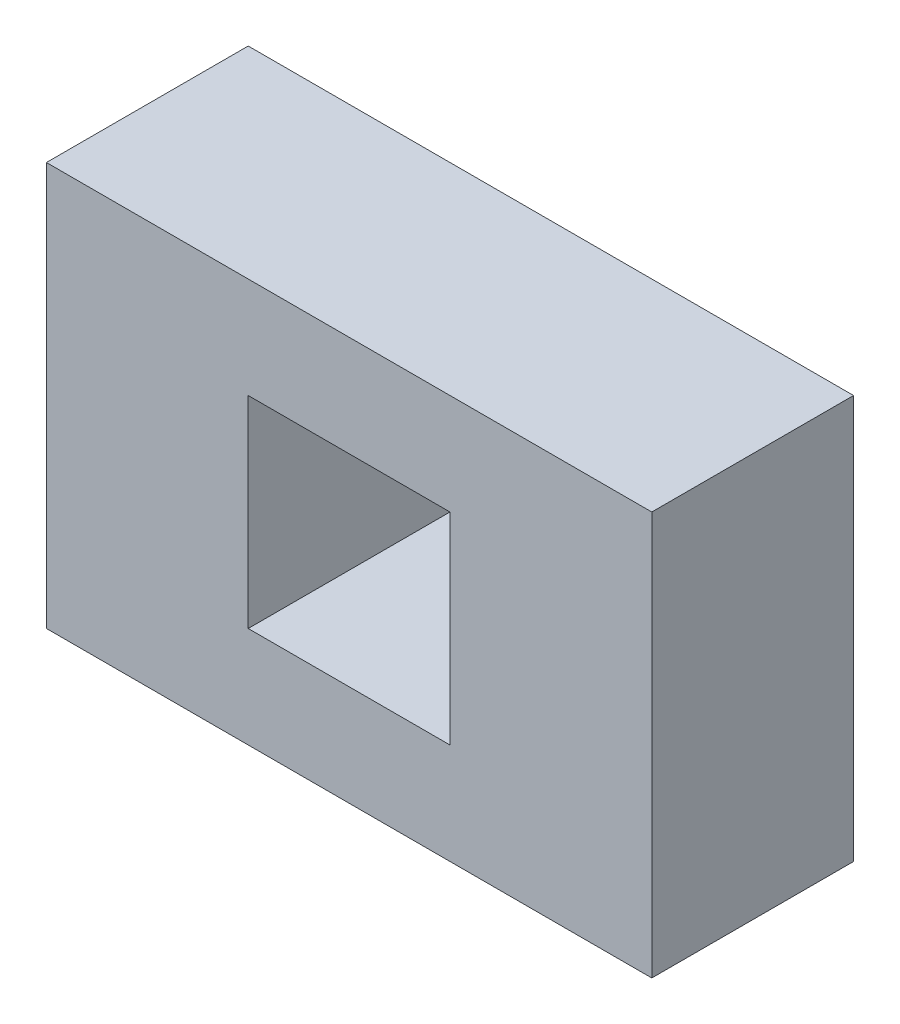
ISO-10303-21;
HEADER;
FILE_DESCRIPTION(('STEP AP214'),'2;1');
FILE_NAME('part.step','',(''),(''),'','','');
FILE_SCHEMA(('AUTOMOTIVE_DESIGN { 1 0 10303 214 1 1 1 1 }'));
ENDSEC;
DATA;
#1=APPLICATION_CONTEXT('core data for automotive mechanical design processes');
#2=APPLICATION_PROTOCOL_DEFINITION('international standard','automotive_design',2000,#1);
#3=PRODUCT_CONTEXT('',#1,'mechanical');
#4=PRODUCT('Part','Part','',(#3));
#5=PRODUCT_RELATED_PRODUCT_CATEGORY('part','',(#4));
#6=PRODUCT_DEFINITION_FORMATION('','',#4);
#7=PRODUCT_DEFINITION_CONTEXT('part definition',#1,'design');
#8=PRODUCT_DEFINITION('design','',#6,#7);
#9=PRODUCT_DEFINITION_SHAPE('','',#8);
#10=(LENGTH_UNIT() NAMED_UNIT(*) SI_UNIT(.MILLI.,.METRE.));
#11=(NAMED_UNIT(*) PLANE_ANGLE_UNIT() SI_UNIT($,.RADIAN.));
#12=(NAMED_UNIT(*) SI_UNIT($,.STERADIAN.) SOLID_ANGLE_UNIT());
#13=UNCERTAINTY_MEASURE_WITH_UNIT(LENGTH_MEASURE(1.E-05),#10,'distance_accuracy_value','');
#14=(GEOMETRIC_REPRESENTATION_CONTEXT(3) GLOBAL_UNCERTAINTY_ASSIGNED_CONTEXT((#13)) GLOBAL_UNIT_ASSIGNED_CONTEXT((#10,
#11,#12)) REPRESENTATION_CONTEXT('',''));
#15=CARTESIAN_POINT('',(0.,0.,0.));
#16=DIRECTION('',(0.,0.,1.));
#17=DIRECTION('',(1.,0.,0.));
#18=AXIS2_PLACEMENT_3D('',#15,#16,#17);
#19=CARTESIAN_POINT('',(0.,0.,5.));
#20=DIRECTION('',(0.,0.,-1.));
#21=DIRECTION('',(-1.,0.,0.));
#22=AXIS2_PLACEMENT_3D('',#19,#20,#21);
#23=PLANE('',#22);
#24=DIRECTION('',(0.,-1.,0.));
#25=VECTOR('',#24,1.);
#26=CARTESIAN_POINT('',(0.,0.,5.));
#27=LINE('',#26,#25);
#28=CARTESIAN_POINT('',(0.,10.,5.));
#29=VERTEX_POINT('',#28);
#30=CARTESIAN_POINT('',(0.,0.,5.));
#31=VERTEX_POINT('',#30);
#32=EDGE_CURVE('E134',#29,#31,#27,.T.);
#33=ORIENTED_EDGE('',*,*,#32,.T.);
#34=DIRECTION('',(1.,0.,0.));
#35=VECTOR('',#34,1.);
#36=CARTESIAN_POINT('',(0.,0.,5.));
#37=LINE('',#36,#35);
#38=CARTESIAN_POINT('',(15.,0.,5.));
#39=VERTEX_POINT('',#38);
#40=EDGE_CURVE('E137',#31,#39,#37,.T.);
#41=ORIENTED_EDGE('',*,*,#40,.T.);
#42=DIRECTION('',(0.,1.,0.));
#43=VECTOR('',#42,1.);
#44=CARTESIAN_POINT('',(15.,0.,5.));
#45=LINE('',#44,#43);
#46=CARTESIAN_POINT('',(15.,10.,5.));
#47=VERTEX_POINT('',#46);
#48=EDGE_CURVE('E140',#39,#47,#45,.T.);
#49=ORIENTED_EDGE('',*,*,#48,.T.);
#50=DIRECTION('',(-1.,0.,0.));
#51=VECTOR('',#50,1.);
#52=CARTESIAN_POINT('',(0.,10.,5.));
#53=LINE('',#52,#51);
#54=EDGE_CURVE('E142',#47,#29,#53,.T.);
#55=ORIENTED_EDGE('',*,*,#54,.T.);
#56=EDGE_LOOP('',(#33,#41,#49,#55));
#57=FACE_BOUND('',#56,.T.);
#58=DIRECTION('',(0.,-1.,0.));
#59=VECTOR('',#58,1.);
#60=CARTESIAN_POINT('',(5.,7.5,5.));
#61=LINE('',#60,#59);
#62=CARTESIAN_POINT('',(5.,7.5,5.));
#63=VERTEX_POINT('',#62);
#64=CARTESIAN_POINT('',(5.,2.5,5.));
#65=VERTEX_POINT('',#64);
#66=EDGE_CURVE('E98',#63,#65,#61,.T.);
#67=ORIENTED_EDGE('',*,*,#66,.F.);
#68=DIRECTION('',(-1.,0.,0.));
#69=VECTOR('',#68,1.);
#70=CARTESIAN_POINT('',(5.,7.5,5.));
#71=LINE('',#70,#69);
#72=CARTESIAN_POINT('',(10.,7.5,5.));
#73=VERTEX_POINT('',#72);
#74=EDGE_CURVE('E120',#73,#63,#71,.T.);
#75=ORIENTED_EDGE('',*,*,#74,.F.);
#76=DIRECTION('',(0.,1.,0.));
#77=VECTOR('',#76,1.);
#78=CARTESIAN_POINT('',(10.,7.5,5.));
#79=LINE('',#78,#77);
#80=CARTESIAN_POINT('',(10.,2.5,5.));
#81=VERTEX_POINT('',#80);
#82=EDGE_CURVE('E118',#81,#73,#79,.T.);
#83=ORIENTED_EDGE('',*,*,#82,.F.);
#84=DIRECTION('',(1.,0.,0.));
#85=VECTOR('',#84,1.);
#86=CARTESIAN_POINT('',(5.,2.5,5.));
#87=LINE('',#86,#85);
#88=EDGE_CURVE('E106',#65,#81,#87,.T.);
#89=ORIENTED_EDGE('',*,*,#88,.F.);
#90=EDGE_LOOP('',(#67,#75,#83,#89));
#91=FACE_BOUND('',#90,.T.);
#92=ADVANCED_FACE('F33',(#57,#91),#23,.F.);
#93=CARTESIAN_POINT('',(0.,0.,0.));
#94=DIRECTION('',(0.,0.,-1.));
#95=DIRECTION('',(-1.,0.,0.));
#96=AXIS2_PLACEMENT_3D('',#93,#94,#95);
#97=PLANE('',#96);
#98=DIRECTION('',(0.,-1.,0.));
#99=VECTOR('',#98,1.);
#100=CARTESIAN_POINT('',(0.,0.,0.));
#101=LINE('',#100,#99);
#102=CARTESIAN_POINT('',(0.,10.,0.));
#103=VERTEX_POINT('',#102);
#104=CARTESIAN_POINT('',(0.,0.,0.));
#105=VERTEX_POINT('',#104);
#106=EDGE_CURVE('E114',#103,#105,#101,.T.);
#107=ORIENTED_EDGE('',*,*,#106,.F.);
#108=DIRECTION('',(-1.,0.,0.));
#109=VECTOR('',#108,1.);
#110=CARTESIAN_POINT('',(0.,10.,0.));
#111=LINE('',#110,#109);
#112=CARTESIAN_POINT('',(15.,10.,0.));
#113=VERTEX_POINT('',#112);
#114=EDGE_CURVE('E138',#113,#103,#111,.T.);
#115=ORIENTED_EDGE('',*,*,#114,.F.);
#116=DIRECTION('',(0.,1.,0.));
#117=VECTOR('',#116,1.);
#118=CARTESIAN_POINT('',(15.,0.,0.));
#119=LINE('',#118,#117);
#120=CARTESIAN_POINT('',(15.,0.,0.));
#121=VERTEX_POINT('',#120);
#122=EDGE_CURVE('E149',#121,#113,#119,.T.);
#123=ORIENTED_EDGE('',*,*,#122,.F.);
#124=DIRECTION('',(1.,0.,0.));
#125=VECTOR('',#124,1.);
#126=CARTESIAN_POINT('',(0.,0.,0.));
#127=LINE('',#126,#125);
#128=EDGE_CURVE('E147',#105,#121,#127,.T.);
#129=ORIENTED_EDGE('',*,*,#128,.F.);
#130=EDGE_LOOP('',(#107,#115,#123,#129));
#131=FACE_BOUND('',#130,.T.);
#132=DIRECTION('',(-1.,0.,0.));
#133=VECTOR('',#132,1.);
#134=CARTESIAN_POINT('',(5.,7.5,0.));
#135=LINE('',#134,#133);
#136=CARTESIAN_POINT('',(10.,7.5,0.));
#137=VERTEX_POINT('',#136);
#138=CARTESIAN_POINT('',(5.,7.5,0.));
#139=VERTEX_POINT('',#138);
#140=EDGE_CURVE('E107',#137,#139,#135,.T.);
#141=ORIENTED_EDGE('',*,*,#140,.T.);
#142=DIRECTION('',(0.,-1.,0.));
#143=VECTOR('',#142,1.);
#144=CARTESIAN_POINT('',(5.,7.5,0.));
#145=LINE('',#144,#143);
#146=CARTESIAN_POINT('',(5.,2.5,0.));
#147=VERTEX_POINT('',#146);
#148=EDGE_CURVE('E56',#139,#147,#145,.T.);
#149=ORIENTED_EDGE('',*,*,#148,.T.);
#150=DIRECTION('',(1.,0.,0.));
#151=VECTOR('',#150,1.);
#152=CARTESIAN_POINT('',(5.,2.5,0.));
#153=LINE('',#152,#151);
#154=CARTESIAN_POINT('',(10.,2.5,0.));
#155=VERTEX_POINT('',#154);
#156=EDGE_CURVE('E113',#147,#155,#153,.T.);
#157=ORIENTED_EDGE('',*,*,#156,.T.);
#158=DIRECTION('',(0.,1.,0.));
#159=VECTOR('',#158,1.);
#160=CARTESIAN_POINT('',(10.,7.5,0.));
#161=LINE('',#160,#159);
#162=EDGE_CURVE('E126',#155,#137,#161,.T.);
#163=ORIENTED_EDGE('',*,*,#162,.T.);
#164=EDGE_LOOP('',(#141,#149,#157,#163));
#165=FACE_BOUND('',#164,.T.);
#166=ADVANCED_FACE('F167',(#131,#165),#97,.T.);
#167=CARTESIAN_POINT('',(0.,0.,5.));
#168=DIRECTION('',(1.,0.,0.));
#169=DIRECTION('',(0.,0.,-1.));
#170=AXIS2_PLACEMENT_3D('',#167,#168,#169);
#171=PLANE('',#170);
#172=ORIENTED_EDGE('',*,*,#106,.T.);
#173=DIRECTION('',(0.,0.,-1.));
#174=VECTOR('',#173,1.);
#175=CARTESIAN_POINT('',(0.,0.,5.));
#176=LINE('',#175,#174);
#177=EDGE_CURVE('E11',#31,#105,#176,.T.);
#178=ORIENTED_EDGE('',*,*,#177,.F.);
#179=ORIENTED_EDGE('',*,*,#32,.F.);
#180=DIRECTION('',(0.,0.,-1.));
#181=VECTOR('',#180,1.);
#182=CARTESIAN_POINT('',(0.,10.,5.));
#183=LINE('',#182,#181);
#184=EDGE_CURVE('E144',#29,#103,#183,.T.);
#185=ORIENTED_EDGE('',*,*,#184,.T.);
#186=EDGE_LOOP('',(#172,#178,#179,#185));
#187=FACE_BOUND('',#186,.T.);
#188=ADVANCED_FACE('F35',(#187),#171,.F.);
#189=CARTESIAN_POINT('',(0.,0.,5.));
#190=DIRECTION('',(0.,1.,0.));
#191=DIRECTION('',(0.,0.,1.));
#192=AXIS2_PLACEMENT_3D('',#189,#190,#191);
#193=PLANE('',#192);
#194=ORIENTED_EDGE('',*,*,#128,.T.);
#195=DIRECTION('',(0.,0.,-1.));
#196=VECTOR('',#195,1.);
#197=CARTESIAN_POINT('',(15.,0.,5.));
#198=LINE('',#197,#196);
#199=EDGE_CURVE('E41',#39,#121,#198,.T.);
#200=ORIENTED_EDGE('',*,*,#199,.F.);
#201=ORIENTED_EDGE('',*,*,#40,.F.);
#202=ORIENTED_EDGE('',*,*,#177,.T.);
#203=EDGE_LOOP('',(#194,#200,#201,#202));
#204=FACE_BOUND('',#203,.T.);
#205=ADVANCED_FACE('F177',(#204),#193,.F.);
#206=CARTESIAN_POINT('',(15.,0.,5.));
#207=DIRECTION('',(-1.,0.,0.));
#208=DIRECTION('',(0.,0.,1.));
#209=AXIS2_PLACEMENT_3D('',#206,#207,#208);
#210=PLANE('',#209);
#211=ORIENTED_EDGE('',*,*,#122,.T.);
#212=DIRECTION('',(0.,0.,-1.));
#213=VECTOR('',#212,1.);
#214=CARTESIAN_POINT('',(15.,10.,5.));
#215=LINE('',#214,#213);
#216=EDGE_CURVE('E154',#47,#113,#215,.T.);
#217=ORIENTED_EDGE('',*,*,#216,.F.);
#218=ORIENTED_EDGE('',*,*,#48,.F.);
#219=ORIENTED_EDGE('',*,*,#199,.T.);
#220=EDGE_LOOP('',(#211,#217,#218,#219));
#221=FACE_BOUND('',#220,.T.);
#222=ADVANCED_FACE('F161',(#221),#210,.F.);
#223=CARTESIAN_POINT('',(0.,10.,5.));
#224=DIRECTION('',(0.,-1.,0.));
#225=DIRECTION('',(0.,0.,-1.));
#226=AXIS2_PLACEMENT_3D('',#223,#224,#225);
#227=PLANE('',#226);
#228=ORIENTED_EDGE('',*,*,#114,.T.);
#229=ORIENTED_EDGE('',*,*,#184,.F.);
#230=ORIENTED_EDGE('',*,*,#54,.F.);
#231=ORIENTED_EDGE('',*,*,#216,.T.);
#232=EDGE_LOOP('',(#228,#229,#230,#231));
#233=FACE_BOUND('',#232,.T.);
#234=ADVANCED_FACE('F171',(#233),#227,.F.);
#235=CARTESIAN_POINT('',(5.,7.5,5.));
#236=DIRECTION('',(1.,0.,0.));
#237=DIRECTION('',(0.,1.,0.));
#238=AXIS2_PLACEMENT_3D('',#235,#236,#237);
#239=PLANE('',#238);
#240=ORIENTED_EDGE('',*,*,#148,.F.);
#241=DIRECTION('',(0.,0.,-1.));
#242=VECTOR('',#241,1.);
#243=CARTESIAN_POINT('',(5.,7.5,5.));
#244=LINE('',#243,#242);
#245=EDGE_CURVE('E102',#63,#139,#244,.T.);
#246=ORIENTED_EDGE('',*,*,#245,.F.);
#247=ORIENTED_EDGE('',*,*,#66,.T.);
#248=DIRECTION('',(0.,0.,-1.));
#249=VECTOR('',#248,1.);
#250=CARTESIAN_POINT('',(5.,2.5,5.));
#251=LINE('',#250,#249);
#252=EDGE_CURVE('E101',#65,#147,#251,.T.);
#253=ORIENTED_EDGE('',*,*,#252,.T.);
#254=EDGE_LOOP('',(#240,#246,#247,#253));
#255=FACE_BOUND('',#254,.T.);
#256=ADVANCED_FACE('F100',(#255),#239,.T.);
#257=CARTESIAN_POINT('',(5.,2.5,5.));
#258=DIRECTION('',(0.,1.,0.));
#259=DIRECTION('',(0.,0.,1.));
#260=AXIS2_PLACEMENT_3D('',#257,#258,#259);
#261=PLANE('',#260);
#262=ORIENTED_EDGE('',*,*,#156,.F.);
#263=ORIENTED_EDGE('',*,*,#252,.F.);
#264=ORIENTED_EDGE('',*,*,#88,.T.);
#265=DIRECTION('',(0.,0.,-1.));
#266=VECTOR('',#265,1.);
#267=CARTESIAN_POINT('',(10.,2.5,5.));
#268=LINE('',#267,#266);
#269=EDGE_CURVE('E115',#81,#155,#268,.T.);
#270=ORIENTED_EDGE('',*,*,#269,.T.);
#271=EDGE_LOOP('',(#262,#263,#264,#270));
#272=FACE_BOUND('',#271,.T.);
#273=ADVANCED_FACE('F110',(#272),#261,.T.);
#274=CARTESIAN_POINT('',(10.,7.5,5.));
#275=DIRECTION('',(-1.,0.,0.));
#276=DIRECTION('',(0.,0.,1.));
#277=AXIS2_PLACEMENT_3D('',#274,#275,#276);
#278=PLANE('',#277);
#279=ORIENTED_EDGE('',*,*,#162,.F.);
#280=ORIENTED_EDGE('',*,*,#269,.F.);
#281=ORIENTED_EDGE('',*,*,#82,.T.);
#282=DIRECTION('',(0.,0.,-1.));
#283=VECTOR('',#282,1.);
#284=CARTESIAN_POINT('',(10.,7.5,5.));
#285=LINE('',#284,#283);
#286=EDGE_CURVE('E48',#73,#137,#285,.T.);
#287=ORIENTED_EDGE('',*,*,#286,.T.);
#288=EDGE_LOOP('',(#279,#280,#281,#287));
#289=FACE_BOUND('',#288,.T.);
#290=ADVANCED_FACE('F200',(#289),#278,.T.);
#291=CARTESIAN_POINT('',(5.,7.5,5.));
#292=DIRECTION('',(0.,-1.,0.));
#293=DIRECTION('',(0.,0.,-1.));
#294=AXIS2_PLACEMENT_3D('',#291,#292,#293);
#295=PLANE('',#294);
#296=ORIENTED_EDGE('',*,*,#140,.F.);
#297=ORIENTED_EDGE('',*,*,#286,.F.);
#298=ORIENTED_EDGE('',*,*,#74,.T.);
#299=ORIENTED_EDGE('',*,*,#245,.T.);
#300=EDGE_LOOP('',(#296,#297,#298,#299));
#301=FACE_BOUND('',#300,.T.);
#302=ADVANCED_FACE('F204',(#301),#295,.T.);
#303=CLOSED_SHELL('',(#92,#166,#188,#205,#222,#234,#256,#273,#290,#302));
#304=MANIFOLD_SOLID_BREP('B2',#303);
#305=ADVANCED_BREP_SHAPE_REPRESENTATION('',(#18,#304),#14);
#306=SHAPE_DEFINITION_REPRESENTATION(#9,#305);
ENDSEC;
END-ISO-10303-21;
